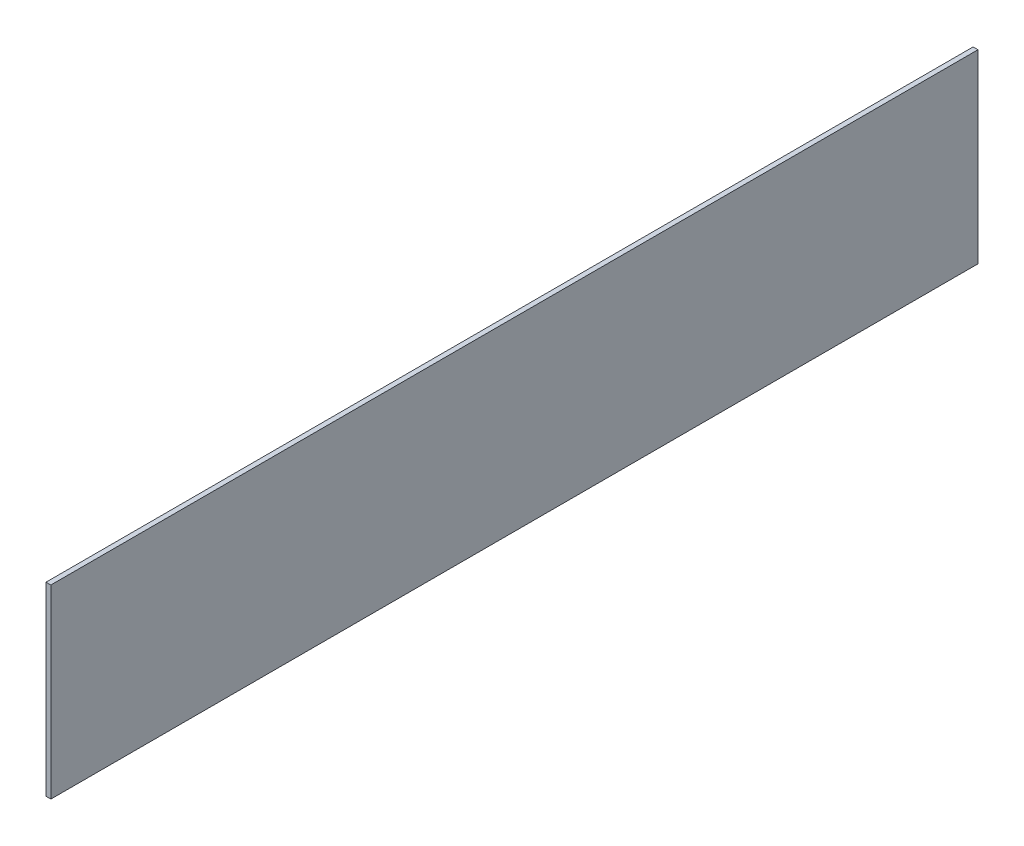
ISO-10303-21;
HEADER;
FILE_DESCRIPTION(('STEP AP214'),'2;1');
FILE_NAME('part.step','',(''),(''),'','','');
FILE_SCHEMA(('AUTOMOTIVE_DESIGN { 1 0 10303 214 1 1 1 1 }'));
ENDSEC;
DATA;
#1=APPLICATION_CONTEXT('core data for automotive mechanical design processes');
#2=APPLICATION_PROTOCOL_DEFINITION('international standard','automotive_design',2000,#1);
#3=PRODUCT_CONTEXT('',#1,'mechanical');
#4=PRODUCT('Part','Part','',(#3));
#5=PRODUCT_RELATED_PRODUCT_CATEGORY('part','',(#4));
#6=PRODUCT_DEFINITION_FORMATION('','',#4);
#7=PRODUCT_DEFINITION_CONTEXT('part definition',#1,'design');
#8=PRODUCT_DEFINITION('design','',#6,#7);
#9=PRODUCT_DEFINITION_SHAPE('','',#8);
#10=(LENGTH_UNIT() NAMED_UNIT(*) SI_UNIT(.MILLI.,.METRE.));
#11=(NAMED_UNIT(*) PLANE_ANGLE_UNIT() SI_UNIT($,.RADIAN.));
#12=(NAMED_UNIT(*) SI_UNIT($,.STERADIAN.) SOLID_ANGLE_UNIT());
#13=UNCERTAINTY_MEASURE_WITH_UNIT(LENGTH_MEASURE(1.E-05),#10,'distance_accuracy_value','');
#14=(GEOMETRIC_REPRESENTATION_CONTEXT(3) GLOBAL_UNCERTAINTY_ASSIGNED_CONTEXT((#13)) GLOBAL_UNIT_ASSIGNED_CONTEXT((#10,
#11,#12)) REPRESENTATION_CONTEXT('',''));
#15=CARTESIAN_POINT('',(0.,0.,0.));
#16=DIRECTION('',(0.,0.,1.));
#17=DIRECTION('',(1.,0.,0.));
#18=AXIS2_PLACEMENT_3D('',#15,#16,#17);
#19=CARTESIAN_POINT('',(2.000000064,38.1,-190.5));
#20=DIRECTION('',(0.,0.,1.));
#21=DIRECTION('',(1.,0.,0.));
#22=AXIS2_PLACEMENT_3D('',#19,#20,#21);
#23=PLANE('',#22);
#24=DIRECTION('',(0.,1.,0.));
#25=VECTOR('',#24,1.);
#26=CARTESIAN_POINT('',(0.,38.1,-190.5));
#27=LINE('',#26,#25);
#28=CARTESIAN_POINT('',(0.,-38.1,-190.5));
#29=VERTEX_POINT('',#28);
#30=CARTESIAN_POINT('',(0.,38.1,-190.5));
#31=VERTEX_POINT('',#30);
#32=EDGE_CURVE('E107',#29,#31,#27,.T.);
#33=ORIENTED_EDGE('',*,*,#32,.T.);
#34=DIRECTION('',(-1.,0.,0.));
#35=VECTOR('',#34,1.);
#36=CARTESIAN_POINT('',(2.000000064,38.1,-190.5));
#37=LINE('',#36,#35);
#38=CARTESIAN_POINT('',(2.000000064,38.1,-190.5));
#39=VERTEX_POINT('',#38);
#40=EDGE_CURVE('E11',#39,#31,#37,.T.);
#41=ORIENTED_EDGE('',*,*,#40,.F.);
#42=DIRECTION('',(0.,1.,0.));
#43=VECTOR('',#42,1.);
#44=CARTESIAN_POINT('',(2.000000064,38.1,-190.5));
#45=LINE('',#44,#43);
#46=CARTESIAN_POINT('',(2.000000064,-38.1,-190.5));
#47=VERTEX_POINT('',#46);
#48=EDGE_CURVE('E91',#47,#39,#45,.T.);
#49=ORIENTED_EDGE('',*,*,#48,.F.);
#50=DIRECTION('',(-1.,0.,0.));
#51=VECTOR('',#50,1.);
#52=CARTESIAN_POINT('',(2.000000064,-38.1,-190.5));
#53=LINE('',#52,#51);
#54=EDGE_CURVE('E103',#47,#29,#53,.T.);
#55=ORIENTED_EDGE('',*,*,#54,.T.);
#56=EDGE_LOOP('',(#33,#41,#49,#55));
#57=FACE_BOUND('',#56,.T.);
#58=ADVANCED_FACE('F39',(#57),#23,.F.);
#59=CARTESIAN_POINT('',(2.000000064,38.1,190.5));
#60=DIRECTION('',(0.,-1.,0.));
#61=DIRECTION('',(0.,0.,-1.));
#62=AXIS2_PLACEMENT_3D('',#59,#60,#61);
#63=PLANE('',#62);
#64=DIRECTION('',(0.,0.,1.));
#65=VECTOR('',#64,1.);
#66=CARTESIAN_POINT('',(0.,38.1,190.5));
#67=LINE('',#66,#65);
#68=CARTESIAN_POINT('',(0.,38.1,190.5));
#69=VERTEX_POINT('',#68);
#70=EDGE_CURVE('E96',#31,#69,#67,.T.);
#71=ORIENTED_EDGE('',*,*,#70,.T.);
#72=DIRECTION('',(-1.,0.,0.));
#73=VECTOR('',#72,1.);
#74=CARTESIAN_POINT('',(2.000000064,38.1,190.5));
#75=LINE('',#74,#73);
#76=CARTESIAN_POINT('',(2.000000064,38.1,190.5));
#77=VERTEX_POINT('',#76);
#78=EDGE_CURVE('E48',#77,#69,#75,.T.);
#79=ORIENTED_EDGE('',*,*,#78,.F.);
#80=DIRECTION('',(0.,0.,1.));
#81=VECTOR('',#80,1.);
#82=CARTESIAN_POINT('',(2.000000064,38.1,190.5));
#83=LINE('',#82,#81);
#84=EDGE_CURVE('E86',#39,#77,#83,.T.);
#85=ORIENTED_EDGE('',*,*,#84,.F.);
#86=ORIENTED_EDGE('',*,*,#40,.T.);
#87=EDGE_LOOP('',(#71,#79,#85,#86));
#88=FACE_BOUND('',#87,.T.);
#89=ADVANCED_FACE('F95',(#88),#63,.F.);
#90=CARTESIAN_POINT('',(2.000000064,38.1,190.5));
#91=DIRECTION('',(0.,0.,-1.));
#92=DIRECTION('',(-1.,0.,0.));
#93=AXIS2_PLACEMENT_3D('',#90,#91,#92);
#94=PLANE('',#93);
#95=DIRECTION('',(0.,-1.,0.));
#96=VECTOR('',#95,1.);
#97=CARTESIAN_POINT('',(0.,38.1,190.5));
#98=LINE('',#97,#96);
#99=CARTESIAN_POINT('',(0.,-38.1,190.5));
#100=VERTEX_POINT('',#99);
#101=EDGE_CURVE('E73',#69,#100,#98,.T.);
#102=ORIENTED_EDGE('',*,*,#101,.T.);
#103=DIRECTION('',(-1.,0.,0.));
#104=VECTOR('',#103,1.);
#105=CARTESIAN_POINT('',(2.000000064,-38.1,190.5));
#106=LINE('',#105,#104);
#107=CARTESIAN_POINT('',(2.000000064,-38.1,190.5));
#108=VERTEX_POINT('',#107);
#109=EDGE_CURVE('E98',#108,#100,#106,.T.);
#110=ORIENTED_EDGE('',*,*,#109,.F.);
#111=DIRECTION('',(0.,-1.,0.));
#112=VECTOR('',#111,1.);
#113=CARTESIAN_POINT('',(2.000000064,38.1,190.5));
#114=LINE('',#113,#112);
#115=EDGE_CURVE('E89',#77,#108,#114,.T.);
#116=ORIENTED_EDGE('',*,*,#115,.F.);
#117=ORIENTED_EDGE('',*,*,#78,.T.);
#118=EDGE_LOOP('',(#102,#110,#116,#117));
#119=FACE_BOUND('',#118,.T.);
#120=ADVANCED_FACE('F99',(#119),#94,.F.);
#121=CARTESIAN_POINT('',(2.000000064,-38.1,190.5));
#122=DIRECTION('',(0.,1.,0.));
#123=DIRECTION('',(0.,0.,1.));
#124=AXIS2_PLACEMENT_3D('',#121,#122,#123);
#125=PLANE('',#124);
#126=DIRECTION('',(0.,0.,-1.));
#127=VECTOR('',#126,1.);
#128=CARTESIAN_POINT('',(0.,-38.1,190.5));
#129=LINE('',#128,#127);
#130=EDGE_CURVE('E79',#100,#29,#129,.T.);
#131=ORIENTED_EDGE('',*,*,#130,.T.);
#132=ORIENTED_EDGE('',*,*,#54,.F.);
#133=DIRECTION('',(0.,0.,-1.));
#134=VECTOR('',#133,1.);
#135=CARTESIAN_POINT('',(2.000000064,-38.1,190.5));
#136=LINE('',#135,#134);
#137=EDGE_CURVE('E56',#108,#47,#136,.T.);
#138=ORIENTED_EDGE('',*,*,#137,.F.);
#139=ORIENTED_EDGE('',*,*,#109,.T.);
#140=EDGE_LOOP('',(#131,#132,#138,#139));
#141=FACE_BOUND('',#140,.T.);
#142=ADVANCED_FACE('F120',(#141),#125,.F.);
#143=CARTESIAN_POINT('',(2.000000064,0.,0.));
#144=DIRECTION('',(1.,0.,0.));
#145=DIRECTION('',(0.,0.,-1.));
#146=AXIS2_PLACEMENT_3D('',#143,#144,#145);
#147=PLANE('',#146);
#148=ORIENTED_EDGE('',*,*,#48,.T.);
#149=ORIENTED_EDGE('',*,*,#84,.T.);
#150=ORIENTED_EDGE('',*,*,#115,.T.);
#151=ORIENTED_EDGE('',*,*,#137,.T.);
#152=EDGE_LOOP('',(#148,#149,#150,#151));
#153=FACE_BOUND('',#152,.T.);
#154=ADVANCED_FACE('F87',(#153),#147,.T.);
#155=CARTESIAN_POINT('',(0.,0.,0.));
#156=DIRECTION('',(1.,0.,0.));
#157=DIRECTION('',(0.,0.,-1.));
#158=AXIS2_PLACEMENT_3D('',#155,#156,#157);
#159=PLANE('',#158);
#160=ORIENTED_EDGE('',*,*,#32,.F.);
#161=ORIENTED_EDGE('',*,*,#130,.F.);
#162=ORIENTED_EDGE('',*,*,#101,.F.);
#163=ORIENTED_EDGE('',*,*,#70,.F.);
#164=EDGE_LOOP('',(#160,#161,#162,#163));
#165=FACE_BOUND('',#164,.T.);
#166=ADVANCED_FACE('F123',(#165),#159,.F.);
#167=CLOSED_SHELL('',(#58,#89,#120,#142,#154,#166));
#168=MANIFOLD_SOLID_BREP('B2',#167);
#169=ADVANCED_BREP_SHAPE_REPRESENTATION('',(#18,#168),#14);
#170=SHAPE_DEFINITION_REPRESENTATION(#9,#169);
ENDSEC;
END-ISO-10303-21;
